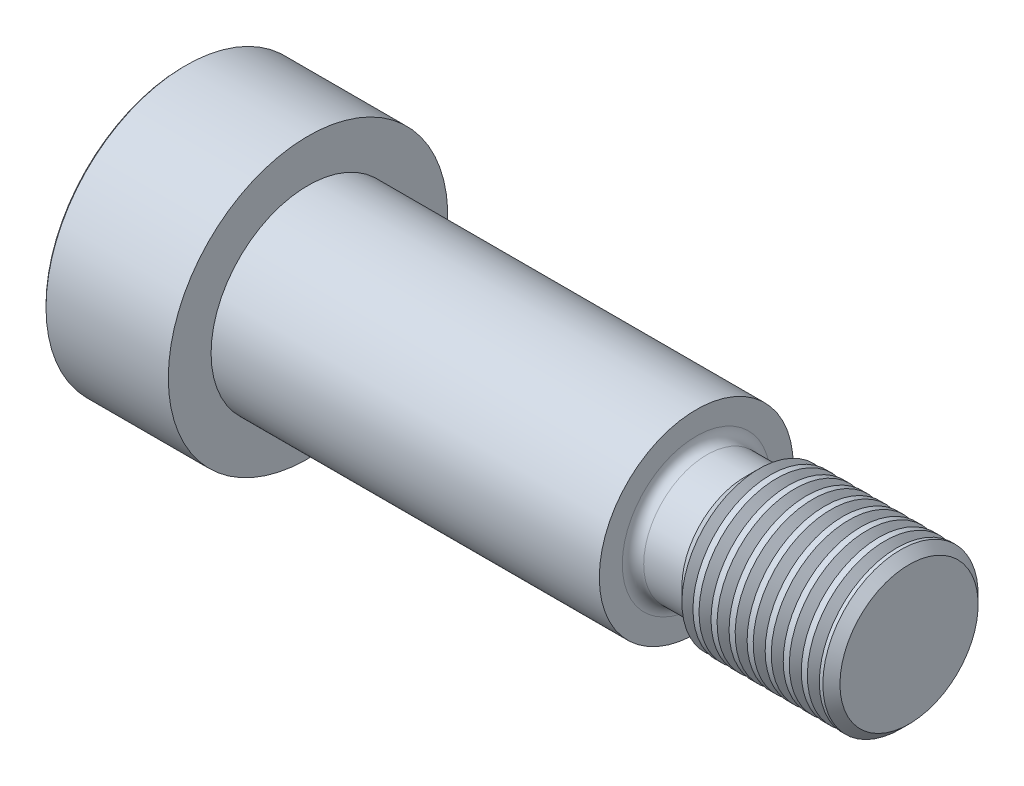
ISO-10303-21;
HEADER;
FILE_DESCRIPTION(('STEP AP214'),'2;1');
FILE_NAME('part.step','',(''),(''),'','','');
FILE_SCHEMA(('AUTOMOTIVE_DESIGN { 1 0 10303 214 1 1 1 1 }'));
ENDSEC;
DATA;
#1=APPLICATION_CONTEXT('core data for automotive mechanical design processes');
#2=APPLICATION_PROTOCOL_DEFINITION('international standard','automotive_design',2000,#1);
#3=PRODUCT_CONTEXT('',#1,'mechanical');
#4=PRODUCT('Part','Part','',(#3));
#5=PRODUCT_RELATED_PRODUCT_CATEGORY('part','',(#4));
#6=PRODUCT_DEFINITION_FORMATION('','',#4);
#7=PRODUCT_DEFINITION_CONTEXT('part definition',#1,'design');
#8=PRODUCT_DEFINITION('design','',#6,#7);
#9=PRODUCT_DEFINITION_SHAPE('','',#8);
#10=(LENGTH_UNIT() NAMED_UNIT(*) SI_UNIT(.MILLI.,.METRE.));
#11=(NAMED_UNIT(*) PLANE_ANGLE_UNIT() SI_UNIT($,.RADIAN.));
#12=(NAMED_UNIT(*) SI_UNIT($,.STERADIAN.) SOLID_ANGLE_UNIT());
#13=UNCERTAINTY_MEASURE_WITH_UNIT(LENGTH_MEASURE(1.E-05),#10,'distance_accuracy_value','');
#14=(GEOMETRIC_REPRESENTATION_CONTEXT(3) GLOBAL_UNCERTAINTY_ASSIGNED_CONTEXT((#13)) GLOBAL_UNIT_ASSIGNED_CONTEXT((#10,
#11,#12)) REPRESENTATION_CONTEXT('',''));
#15=CARTESIAN_POINT('',(0.,0.,0.));
#16=DIRECTION('',(0.,0.,1.));
#17=DIRECTION('',(1.,0.,0.));
#18=AXIS2_PLACEMENT_3D('',#15,#16,#17);
#19=CARTESIAN_POINT('',(0.,0.,0.));
#20=DIRECTION('',(-1.,0.,0.));
#21=DIRECTION('',(0.,0.,1.));
#22=AXIS2_PLACEMENT_3D('',#19,#20,#21);
#23=PLANE('',#22);
#24=CARTESIAN_POINT('',(0.,0.,0.));
#25=DIRECTION('',(-1.,0.,0.));
#26=DIRECTION('',(0.,0.,1.));
#27=AXIS2_PLACEMENT_3D('',#24,#25,#26);
#28=CIRCLE('',#27,17.75);
#29=CARTESIAN_POINT('',(0.,0.,17.75));
#30=VERTEX_POINT('',#29);
#31=EDGE_CURVE('E39',#30,#30,#28,.T.);
#32=ORIENTED_EDGE('',*,*,#31,.T.);
#33=EDGE_LOOP('',(#32));
#34=FACE_BOUND('',#33,.T.);
#35=DIRECTION('',(0.,-0.500000000000002,-0.866025403784438));
#36=VECTOR('',#35,1.);
#37=CARTESIAN_POINT('',(0.,-3.46410161513775,6.));
#38=LINE('',#37,#36);
#39=CARTESIAN_POINT('',(0.,-3.46410161513775,6.));
#40=VERTEX_POINT('',#39);
#41=CARTESIAN_POINT('',(0.,-6.92820323027552,0.));
#42=VERTEX_POINT('',#41);
#43=EDGE_CURVE('E47',#40,#42,#38,.T.);
#44=ORIENTED_EDGE('',*,*,#43,.T.);
#45=DIRECTION('',(0.,0.500000000000002,-0.866025403784438));
#46=VECTOR('',#45,1.);
#47=CARTESIAN_POINT('',(0.,-6.92820323027552,0.));
#48=LINE('',#47,#46);
#49=CARTESIAN_POINT('',(0.,-3.46410161513775,-6.));
#50=VERTEX_POINT('',#49);
#51=EDGE_CURVE('E179',#42,#50,#48,.T.);
#52=ORIENTED_EDGE('',*,*,#51,.T.);
#53=DIRECTION('',(0.,1.,0.));
#54=VECTOR('',#53,1.);
#55=CARTESIAN_POINT('',(0.,-3.46410161513775,-6.));
#56=LINE('',#55,#54);
#57=CARTESIAN_POINT('',(0.,3.46410161513776,-6.));
#58=VERTEX_POINT('',#57);
#59=EDGE_CURVE('E132',#50,#58,#56,.T.);
#60=ORIENTED_EDGE('',*,*,#59,.T.);
#61=DIRECTION('',(0.,0.5,0.866025403784439));
#62=VECTOR('',#61,1.);
#63=CARTESIAN_POINT('',(0.,3.46410161513776,-6.));
#64=LINE('',#63,#62);
#65=CARTESIAN_POINT('',(0.,6.92820323027551,0.));
#66=VERTEX_POINT('',#65);
#67=EDGE_CURVE('E262',#58,#66,#64,.T.);
#68=ORIENTED_EDGE('',*,*,#67,.T.);
#69=DIRECTION('',(0.,-0.5,0.866025403784439));
#70=VECTOR('',#69,1.);
#71=CARTESIAN_POINT('',(0.,6.92820323027551,0.));
#72=LINE('',#71,#70);
#73=CARTESIAN_POINT('',(0.,3.46410161513776,6.));
#74=VERTEX_POINT('',#73);
#75=EDGE_CURVE('E264',#66,#74,#72,.T.);
#76=ORIENTED_EDGE('',*,*,#75,.T.);
#77=DIRECTION('',(0.,-1.,0.));
#78=VECTOR('',#77,1.);
#79=CARTESIAN_POINT('',(0.,3.46410161513776,6.));
#80=LINE('',#79,#78);
#81=EDGE_CURVE('E266',#74,#40,#80,.T.);
#82=ORIENTED_EDGE('',*,*,#81,.T.);
#83=EDGE_LOOP('',(#44,#52,#60,#68,#76,#82));
#84=FACE_BOUND('',#83,.T.);
#85=ADVANCED_FACE('F30',(#34,#84),#23,.T.);
#86=CARTESIAN_POINT('',(72.3,0.,0.));
#87=DIRECTION('',(1.,0.,0.));
#88=DIRECTION('',(0.,0.,-1.));
#89=AXIS2_PLACEMENT_3D('',#86,#87,#88);
#90=CONICAL_SURFACE('',#89,8.15,0.785398163397447);
#91=CARTESIAN_POINT('',(74.0786683533554,0.,0.));
#92=DIRECTION('',(-1.,0.,0.));
#93=DIRECTION('',(0.,-1.,0.));
#94=AXIS2_PLACEMENT_3D('',#91,#92,#93);
#95=CIRCLE('',#94,9.92866835335544);
#96=CARTESIAN_POINT('',(74.0786683533554,-9.92866835335544,0.));
#97=VERTEX_POINT('',#96);
#98=EDGE_CURVE('E172',#97,#97,#95,.F.);
#99=ORIENTED_EDGE('',*,*,#98,.F.);
#100=EDGE_LOOP('',(#99));
#101=FACE_BOUND('',#100,.T.);
#102=CARTESIAN_POINT('',(72.3,0.,0.));
#103=DIRECTION('',(-1.,0.,0.));
#104=DIRECTION('',(0.,0.,1.));
#105=AXIS2_PLACEMENT_3D('',#102,#103,#104);
#106=CIRCLE('',#105,8.15);
#107=CARTESIAN_POINT('',(72.3,0.,8.15));
#108=VERTEX_POINT('',#107);
#109=EDGE_CURVE('E161',#108,#108,#106,.T.);
#110=ORIENTED_EDGE('',*,*,#109,.F.);
#111=EDGE_LOOP('',(#110));
#112=FACE_BOUND('',#111,.T.);
#113=ADVANCED_FACE('F319',(#101,#112),#90,.T.);
#114=CARTESIAN_POINT('',(-6.34999999999999,0.,0.));
#115=DIRECTION('',(-1.,0.,0.));
#116=DIRECTION('',(0.,0.,1.));
#117=AXIS2_PLACEMENT_3D('',#114,#115,#116);
#118=CYLINDRICAL_SURFACE('',#117,8.15);
#119=ORIENTED_EDGE('',*,*,#109,.T.);
#120=EDGE_LOOP('',(#119));
#121=FACE_BOUND('',#120,.T.);
#122=CARTESIAN_POINT('',(67.38,0.,0.));
#123=DIRECTION('',(-1.,0.,0.));
#124=DIRECTION('',(0.,0.,1.));
#125=AXIS2_PLACEMENT_3D('',#122,#123,#124);
#126=CIRCLE('',#125,8.15);
#127=CARTESIAN_POINT('',(67.38,0.,8.15));
#128=VERTEX_POINT('',#127);
#129=EDGE_CURVE('E158',#128,#128,#126,.T.);
#130=ORIENTED_EDGE('',*,*,#129,.F.);
#131=EDGE_LOOP('',(#130));
#132=FACE_BOUND('',#131,.T.);
#133=ADVANCED_FACE('F325',(#121,#132),#118,.T.);
#134=CARTESIAN_POINT('',(67.38,0.,0.));
#135=DIRECTION('',(-1.,0.,0.));
#136=DIRECTION('',(0.,0.,1.));
#137=AXIS2_PLACEMENT_3D('',#134,#135,#136);
#138=TOROIDAL_SURFACE('',#137,9.53,1.38);
#139=ORIENTED_EDGE('',*,*,#129,.T.);
#140=EDGE_LOOP('',(#139));
#141=FACE_BOUND('',#140,.T.);
#142=CARTESIAN_POINT('',(66.,0.,0.));
#143=DIRECTION('',(-1.,0.,0.));
#144=DIRECTION('',(0.,0.,1.));
#145=AXIS2_PLACEMENT_3D('',#142,#143,#144);
#146=CIRCLE('',#145,9.53);
#147=CARTESIAN_POINT('',(66.,0.,9.53));
#148=VERTEX_POINT('',#147);
#149=EDGE_CURVE('E155',#148,#148,#146,.T.);
#150=ORIENTED_EDGE('',*,*,#149,.F.);
#151=EDGE_LOOP('',(#150));
#152=FACE_BOUND('',#151,.T.);
#153=ADVANCED_FACE('F346',(#141,#152),#138,.F.);
#154=CARTESIAN_POINT('',(66.,12.49,0.));
#155=DIRECTION('',(1.,0.,0.));
#156=DIRECTION('',(0.,0.,-1.));
#157=AXIS2_PLACEMENT_3D('',#154,#155,#156);
#158=PLANE('',#157);
#159=ORIENTED_EDGE('',*,*,#149,.T.);
#160=EDGE_LOOP('',(#159));
#161=FACE_BOUND('',#160,.T.);
#162=CARTESIAN_POINT('',(66.,0.,0.));
#163=DIRECTION('',(-1.,0.,0.));
#164=DIRECTION('',(0.,0.,1.));
#165=AXIS2_PLACEMENT_3D('',#162,#163,#164);
#166=CIRCLE('',#165,12.49);
#167=CARTESIAN_POINT('',(66.,0.,12.49));
#168=VERTEX_POINT('',#167);
#169=EDGE_CURVE('E152',#168,#168,#166,.T.);
#170=ORIENTED_EDGE('',*,*,#169,.F.);
#171=EDGE_LOOP('',(#170));
#172=FACE_BOUND('',#171,.T.);
#173=ADVANCED_FACE('F342',(#161,#172),#158,.T.);
#174=CARTESIAN_POINT('',(-6.34999999999999,0.,0.));
#175=DIRECTION('',(-1.,0.,0.));
#176=DIRECTION('',(0.,0.,1.));
#177=AXIS2_PLACEMENT_3D('',#174,#175,#176);
#178=CYLINDRICAL_SURFACE('',#177,12.49);
#179=ORIENTED_EDGE('',*,*,#169,.T.);
#180=EDGE_LOOP('',(#179));
#181=FACE_BOUND('',#180,.T.);
#182=CARTESIAN_POINT('',(16.,0.,0.));
#183=DIRECTION('',(-1.,0.,0.));
#184=DIRECTION('',(0.,0.,1.));
#185=AXIS2_PLACEMENT_3D('',#182,#183,#184);
#186=CIRCLE('',#185,12.49);
#187=CARTESIAN_POINT('',(16.,0.,12.49));
#188=VERTEX_POINT('',#187);
#189=EDGE_CURVE('E149',#188,#188,#186,.T.);
#190=ORIENTED_EDGE('',*,*,#189,.F.);
#191=EDGE_LOOP('',(#190));
#192=FACE_BOUND('',#191,.T.);
#193=ADVANCED_FACE('F338',(#181,#192),#178,.T.);
#194=CARTESIAN_POINT('',(16.,18.,0.));
#195=DIRECTION('',(1.,0.,0.));
#196=DIRECTION('',(0.,0.,-1.));
#197=AXIS2_PLACEMENT_3D('',#194,#195,#196);
#198=PLANE('',#197);
#199=ORIENTED_EDGE('',*,*,#189,.T.);
#200=EDGE_LOOP('',(#199));
#201=FACE_BOUND('',#200,.T.);
#202=CARTESIAN_POINT('',(16.,0.,0.));
#203=DIRECTION('',(-1.,0.,0.));
#204=DIRECTION('',(0.,0.,1.));
#205=AXIS2_PLACEMENT_3D('',#202,#203,#204);
#206=CIRCLE('',#205,18.);
#207=CARTESIAN_POINT('',(16.,0.,18.));
#208=VERTEX_POINT('',#207);
#209=EDGE_CURVE('E145',#208,#208,#206,.T.);
#210=ORIENTED_EDGE('',*,*,#209,.F.);
#211=EDGE_LOOP('',(#210));
#212=FACE_BOUND('',#211,.T.);
#213=ADVANCED_FACE('F334',(#201,#212),#198,.T.);
#214=CARTESIAN_POINT('',(-6.34999999999999,0.,0.));
#215=DIRECTION('',(-1.,0.,0.));
#216=DIRECTION('',(0.,0.,1.));
#217=AXIS2_PLACEMENT_3D('',#214,#215,#216);
#218=CYLINDRICAL_SURFACE('',#217,18.);
#219=CARTESIAN_POINT('',(0.249999999999997,0.,0.));
#220=DIRECTION('',(-1.,0.,0.));
#221=DIRECTION('',(0.,0.,1.));
#222=AXIS2_PLACEMENT_3D('',#219,#220,#221);
#223=CIRCLE('',#222,18.);
#224=CARTESIAN_POINT('',(0.249999999999997,0.,18.));
#225=VERTEX_POINT('',#224);
#226=EDGE_CURVE('E11',#225,#225,#223,.F.);
#227=ORIENTED_EDGE('',*,*,#226,.T.);
#228=EDGE_LOOP('',(#227));
#229=FACE_BOUND('',#228,.T.);
#230=ORIENTED_EDGE('',*,*,#209,.T.);
#231=EDGE_LOOP('',(#230));
#232=FACE_BOUND('',#231,.T.);
#233=ADVANCED_FACE('F331',(#229,#232),#218,.T.);
#234=CARTESIAN_POINT('',(0.,0.,0.));
#235=DIRECTION('',(1.,0.,0.));
#236=DIRECTION('',(0.,0.,-1.));
#237=AXIS2_PLACEMENT_3D('',#234,#235,#236);
#238=CONICAL_SURFACE('',#237,17.75,0.785398163397448);
#239=ORIENTED_EDGE('',*,*,#226,.F.);
#240=EDGE_LOOP('',(#239));
#241=FACE_BOUND('',#240,.T.);
#242=ORIENTED_EDGE('',*,*,#31,.F.);
#243=EDGE_LOOP('',(#242));
#244=FACE_BOUND('',#243,.T.);
#245=ADVANCED_FACE('F32',(#241,#244),#238,.T.);
#246=CARTESIAN_POINT('',(10.,-6.92820323027552,0.));
#247=DIRECTION('',(0.,0.866025403784438,0.500000000000002));
#248=DIRECTION('',(0.,-0.500000000000002,0.866025403784438));
#249=AXIS2_PLACEMENT_3D('',#246,#247,#248);
#250=PLANE('',#249);
#251=DIRECTION('',(0.,0.500000000000002,-0.866025403784438));
#252=VECTOR('',#251,1.);
#253=CARTESIAN_POINT('',(10.,-6.92820323027552,0.));
#254=LINE('',#253,#252);
#255=CARTESIAN_POINT('',(10.,-6.92820323027552,0.));
#256=VERTEX_POINT('',#255);
#257=CARTESIAN_POINT('',(10.,-5.19615242270663,-3.00000000000001));
#258=VERTEX_POINT('',#257);
#259=EDGE_CURVE('E115',#256,#258,#254,.T.);
#260=ORIENTED_EDGE('',*,*,#259,.T.);
#261=CARTESIAN_POINT('',(10.,-3.46410161513775,-6.));
#262=VERTEX_POINT('',#261);
#263=EDGE_CURVE('E108',#258,#262,#254,.T.);
#264=ORIENTED_EDGE('',*,*,#263,.T.);
#265=DIRECTION('',(-1.,0.,0.));
#266=VECTOR('',#265,1.);
#267=CARTESIAN_POINT('',(10.,-3.46410161513775,-6.));
#268=LINE('',#267,#266);
#269=EDGE_CURVE('E112',#262,#50,#268,.T.);
#270=ORIENTED_EDGE('',*,*,#269,.T.);
#271=ORIENTED_EDGE('',*,*,#51,.F.);
#272=DIRECTION('',(-1.,0.,0.));
#273=VECTOR('',#272,1.);
#274=CARTESIAN_POINT('',(10.,-6.92820323027552,0.));
#275=LINE('',#274,#273);
#276=EDGE_CURVE('E259',#256,#42,#275,.T.);
#277=ORIENTED_EDGE('',*,*,#276,.F.);
#278=EDGE_LOOP('',(#260,#264,#270,#271,#277));
#279=FACE_BOUND('',#278,.T.);
#280=ADVANCED_FACE('F110',(#279),#250,.T.);
#281=CARTESIAN_POINT('',(10.,-3.46410161513775,-6.));
#282=DIRECTION('',(0.,0.,1.));
#283=DIRECTION('',(1.,0.,0.));
#284=AXIS2_PLACEMENT_3D('',#281,#282,#283);
#285=PLANE('',#284);
#286=DIRECTION('',(0.,1.,0.));
#287=VECTOR('',#286,1.);
#288=CARTESIAN_POINT('',(10.,-3.46410161513775,-6.));
#289=LINE('',#288,#287);
#290=CARTESIAN_POINT('',(10.,0.,-6.));
#291=VERTEX_POINT('',#290);
#292=EDGE_CURVE('E120',#262,#291,#289,.T.);
#293=ORIENTED_EDGE('',*,*,#292,.T.);
#294=CARTESIAN_POINT('',(10.,3.46410161513776,-6.));
#295=VERTEX_POINT('',#294);
#296=EDGE_CURVE('E127',#291,#295,#289,.T.);
#297=ORIENTED_EDGE('',*,*,#296,.T.);
#298=DIRECTION('',(-1.,0.,0.));
#299=VECTOR('',#298,1.);
#300=CARTESIAN_POINT('',(10.,3.46410161513776,-6.));
#301=LINE('',#300,#299);
#302=EDGE_CURVE('E134',#295,#58,#301,.T.);
#303=ORIENTED_EDGE('',*,*,#302,.T.);
#304=ORIENTED_EDGE('',*,*,#59,.F.);
#305=ORIENTED_EDGE('',*,*,#269,.F.);
#306=EDGE_LOOP('',(#293,#297,#303,#304,#305));
#307=FACE_BOUND('',#306,.T.);
#308=ADVANCED_FACE('F130',(#307),#285,.T.);
#309=CARTESIAN_POINT('',(10.,3.46410161513776,-6.));
#310=DIRECTION('',(0.,-0.866025403784438,0.5));
#311=DIRECTION('',(0.,-0.5,-0.866025403784438));
#312=AXIS2_PLACEMENT_3D('',#309,#310,#311);
#313=PLANE('',#312);
#314=DIRECTION('',(0.,0.5,0.866025403784439));
#315=VECTOR('',#314,1.);
#316=CARTESIAN_POINT('',(10.,3.46410161513776,-6.));
#317=LINE('',#316,#315);
#318=CARTESIAN_POINT('',(10.,5.19615242270663,-3.));
#319=VERTEX_POINT('',#318);
#320=EDGE_CURVE('E246',#295,#319,#317,.T.);
#321=ORIENTED_EDGE('',*,*,#320,.T.);
#322=CARTESIAN_POINT('',(10.,6.92820323027551,0.));
#323=VERTEX_POINT('',#322);
#324=EDGE_CURVE('E126',#319,#323,#317,.T.);
#325=ORIENTED_EDGE('',*,*,#324,.T.);
#326=DIRECTION('',(-1.,0.,0.));
#327=VECTOR('',#326,1.);
#328=CARTESIAN_POINT('',(10.,6.92820323027551,0.));
#329=LINE('',#328,#327);
#330=EDGE_CURVE('E140',#323,#66,#329,.T.);
#331=ORIENTED_EDGE('',*,*,#330,.T.);
#332=ORIENTED_EDGE('',*,*,#67,.F.);
#333=ORIENTED_EDGE('',*,*,#302,.F.);
#334=EDGE_LOOP('',(#321,#325,#331,#332,#333));
#335=FACE_BOUND('',#334,.T.);
#336=ADVANCED_FACE('F281',(#335),#313,.T.);
#337=CARTESIAN_POINT('',(10.,6.92820323027551,0.));
#338=DIRECTION('',(0.,-0.866025403784438,-0.5));
#339=DIRECTION('',(0.,0.5,-0.866025403784438));
#340=AXIS2_PLACEMENT_3D('',#337,#338,#339);
#341=PLANE('',#340);
#342=DIRECTION('',(0.,-0.5,0.866025403784439));
#343=VECTOR('',#342,1.);
#344=CARTESIAN_POINT('',(10.,6.92820323027551,0.));
#345=LINE('',#344,#343);
#346=CARTESIAN_POINT('',(10.,5.19615242270663,3.));
#347=VERTEX_POINT('',#346);
#348=EDGE_CURVE('E250',#323,#347,#345,.T.);
#349=ORIENTED_EDGE('',*,*,#348,.T.);
#350=CARTESIAN_POINT('',(10.,3.46410161513776,6.));
#351=VERTEX_POINT('',#350);
#352=EDGE_CURVE('E249',#347,#351,#345,.T.);
#353=ORIENTED_EDGE('',*,*,#352,.T.);
#354=DIRECTION('',(-1.,0.,0.));
#355=VECTOR('',#354,1.);
#356=CARTESIAN_POINT('',(10.,3.46410161513776,6.));
#357=LINE('',#356,#355);
#358=EDGE_CURVE('E274',#351,#74,#357,.T.);
#359=ORIENTED_EDGE('',*,*,#358,.T.);
#360=ORIENTED_EDGE('',*,*,#75,.F.);
#361=ORIENTED_EDGE('',*,*,#330,.F.);
#362=EDGE_LOOP('',(#349,#353,#359,#360,#361));
#363=FACE_BOUND('',#362,.T.);
#364=ADVANCED_FACE('F286',(#363),#341,.T.);
#365=CARTESIAN_POINT('',(10.,3.46410161513776,6.));
#366=DIRECTION('',(0.,0.,-1.));
#367=DIRECTION('',(-1.,0.,0.));
#368=AXIS2_PLACEMENT_3D('',#365,#366,#367);
#369=PLANE('',#368);
#370=DIRECTION('',(0.,-1.,0.));
#371=VECTOR('',#370,1.);
#372=CARTESIAN_POINT('',(10.,3.46410161513776,6.));
#373=LINE('',#372,#371);
#374=CARTESIAN_POINT('',(10.,0.,6.));
#375=VERTEX_POINT('',#374);
#376=EDGE_CURVE('E55',#351,#375,#373,.T.);
#377=ORIENTED_EDGE('',*,*,#376,.T.);
#378=CARTESIAN_POINT('',(10.,-3.46410161513775,6.));
#379=VERTEX_POINT('',#378);
#380=EDGE_CURVE('E253',#375,#379,#373,.T.);
#381=ORIENTED_EDGE('',*,*,#380,.T.);
#382=DIRECTION('',(-1.,0.,0.));
#383=VECTOR('',#382,1.);
#384=CARTESIAN_POINT('',(10.,-3.46410161513775,6.));
#385=LINE('',#384,#383);
#386=EDGE_CURVE('E271',#379,#40,#385,.T.);
#387=ORIENTED_EDGE('',*,*,#386,.T.);
#388=ORIENTED_EDGE('',*,*,#81,.F.);
#389=ORIENTED_EDGE('',*,*,#358,.F.);
#390=EDGE_LOOP('',(#377,#381,#387,#388,#389));
#391=FACE_BOUND('',#390,.T.);
#392=ADVANCED_FACE('F311',(#391),#369,.T.);
#393=CARTESIAN_POINT('',(10.,-3.46410161513775,6.));
#394=DIRECTION('',(0.,0.866025403784438,-0.500000000000002));
#395=DIRECTION('',(0.,0.500000000000002,0.866025403784438));
#396=AXIS2_PLACEMENT_3D('',#393,#394,#395);
#397=PLANE('',#396);
#398=DIRECTION('',(0.,-0.500000000000002,-0.866025403784438));
#399=VECTOR('',#398,1.);
#400=CARTESIAN_POINT('',(10.,-3.46410161513775,6.));
#401=LINE('',#400,#399);
#402=CARTESIAN_POINT('',(10.,-5.19615242270663,3.00000000000001));
#403=VERTEX_POINT('',#402);
#404=EDGE_CURVE('E256',#379,#403,#401,.T.);
#405=ORIENTED_EDGE('',*,*,#404,.T.);
#406=EDGE_CURVE('E255',#403,#256,#401,.T.);
#407=ORIENTED_EDGE('',*,*,#406,.T.);
#408=ORIENTED_EDGE('',*,*,#276,.T.);
#409=ORIENTED_EDGE('',*,*,#43,.F.);
#410=ORIENTED_EDGE('',*,*,#386,.F.);
#411=EDGE_LOOP('',(#405,#407,#408,#409,#410));
#412=FACE_BOUND('',#411,.T.);
#413=ADVANCED_FACE('F304',(#412),#397,.T.);
#414=CARTESIAN_POINT('',(10.,-6.92820323027552,0.));
#415=DIRECTION('',(-1.,0.,0.));
#416=DIRECTION('',(0.,0.,1.));
#417=AXIS2_PLACEMENT_3D('',#414,#415,#416);
#418=PLANE('',#417);
#419=ORIENTED_EDGE('',*,*,#376,.F.);
#420=ORIENTED_EDGE('',*,*,#352,.F.);
#421=CARTESIAN_POINT('',(10.,0.,0.));
#422=DIRECTION('',(-1.,0.,0.));
#423=DIRECTION('',(0.,0.,1.));
#424=AXIS2_PLACEMENT_3D('',#421,#422,#423);
#425=CIRCLE('',#424,6.);
#426=EDGE_CURVE('E139',#375,#347,#425,.T.);
#427=ORIENTED_EDGE('',*,*,#426,.F.);
#428=EDGE_LOOP('',(#419,#420,#427));
#429=FACE_BOUND('',#428,.T.);
#430=ADVANCED_FACE('F302',(#429),#418,.T.);
#431=ORIENTED_EDGE('',*,*,#348,.F.);
#432=ORIENTED_EDGE('',*,*,#324,.F.);
#433=EDGE_CURVE('E146',#347,#319,#425,.T.);
#434=ORIENTED_EDGE('',*,*,#433,.F.);
#435=EDGE_LOOP('',(#431,#432,#434));
#436=FACE_BOUND('',#435,.T.);
#437=ADVANCED_FACE('F295',(#436),#418,.T.);
#438=ORIENTED_EDGE('',*,*,#320,.F.);
#439=ORIENTED_EDGE('',*,*,#296,.F.);
#440=EDGE_CURVE('E292',#319,#291,#425,.T.);
#441=ORIENTED_EDGE('',*,*,#440,.F.);
#442=EDGE_LOOP('',(#438,#439,#441));
#443=FACE_BOUND('',#442,.T.);
#444=ADVANCED_FACE('F291',(#443),#418,.T.);
#445=ORIENTED_EDGE('',*,*,#292,.F.);
#446=ORIENTED_EDGE('',*,*,#263,.F.);
#447=EDGE_CURVE('E122',#291,#258,#425,.T.);
#448=ORIENTED_EDGE('',*,*,#447,.F.);
#449=EDGE_LOOP('',(#445,#446,#448));
#450=FACE_BOUND('',#449,.T.);
#451=ADVANCED_FACE('F121',(#450),#418,.T.);
#452=ORIENTED_EDGE('',*,*,#259,.F.);
#453=ORIENTED_EDGE('',*,*,#406,.F.);
#454=EDGE_CURVE('E137',#258,#403,#425,.T.);
#455=ORIENTED_EDGE('',*,*,#454,.F.);
#456=EDGE_LOOP('',(#452,#453,#455));
#457=FACE_BOUND('',#456,.T.);
#458=ADVANCED_FACE('F316',(#457),#418,.T.);
#459=ORIENTED_EDGE('',*,*,#404,.F.);
#460=ORIENTED_EDGE('',*,*,#380,.F.);
#461=EDGE_CURVE('E133',#403,#375,#425,.T.);
#462=ORIENTED_EDGE('',*,*,#461,.F.);
#463=EDGE_LOOP('',(#459,#460,#462));
#464=FACE_BOUND('',#463,.T.);
#465=ADVANCED_FACE('F306',(#464),#418,.T.);
#466=CARTESIAN_POINT('',(13.4641016151378,0.,0.));
#467=DIRECTION('',(-1.,0.,0.));
#468=DIRECTION('',(0.,0.,1.));
#469=AXIS2_PLACEMENT_3D('',#466,#467,#468);
#470=CONICAL_SURFACE('',#469,0.,1.04719755119659);
#471=ORIENTED_EDGE('',*,*,#426,.T.);
#472=ORIENTED_EDGE('',*,*,#433,.T.);
#473=ORIENTED_EDGE('',*,*,#440,.T.);
#474=ORIENTED_EDGE('',*,*,#447,.T.);
#475=ORIENTED_EDGE('',*,*,#454,.T.);
#476=ORIENTED_EDGE('',*,*,#461,.T.);
#477=EDGE_LOOP('',(#471,#472,#473,#474,#475,#476));
#478=FACE_BOUND('',#477,.T.);
#479=CARTESIAN_POINT('',(13.4641016151378,0.,0.));
#480=VERTEX_POINT('',#479);
#481=VERTEX_LOOP('',#480);
#482=FACE_BOUND('',#481,.T.);
#483=ADVANCED_FACE('F298',(#478,#482),#470,.F.);
#484=CARTESIAN_POINT('',(77.3147953734802,0.,0.));
#485=DIRECTION('',(1.,0.,0.));
#486=DIRECTION('',(0.,1.,0.));
#487=AXIS2_PLACEMENT_3D('',#484,#485,#486);
#488=CONICAL_SURFACE('',#487,12.49,0.959931088596885);
#489=CARTESIAN_POINT('',(75.571278603338,0.,0.));
#490=DIRECTION('',(1.,0.,0.));
#491=DIRECTION('',(0.,1.,0.));
#492=AXIS2_PLACEMENT_3D('',#489,#490,#491);
#493=CIRCLE('',#492,10.);
#494=CARTESIAN_POINT('',(75.571278603338,10.,0.));
#495=VERTEX_POINT('',#494);
#496=EDGE_CURVE('E175',#495,#495,#493,.F.);
#497=ORIENTED_EDGE('',*,*,#496,.T.);
#498=EDGE_LOOP('',(#497));
#499=FACE_BOUND('',#498,.T.);
#500=CARTESIAN_POINT('',(74.8,0.,0.));
#501=DIRECTION('',(-1.,0.,0.));
#502=DIRECTION('',(0.,-1.,0.));
#503=AXIS2_PLACEMENT_3D('',#500,#501,#502);
#504=CIRCLE('',#503,8.89850000000001);
#505=CARTESIAN_POINT('',(74.8,-8.8985,0.));
#506=VERTEX_POINT('',#505);
#507=EDGE_CURVE('E176',#506,#506,#504,.T.);
#508=ORIENTED_EDGE('',*,*,#507,.F.);
#509=EDGE_LOOP('',(#508));
#510=FACE_BOUND('',#509,.T.);
#511=ADVANCED_FACE('F481',(#499,#510),#488,.T.);
#512=CARTESIAN_POINT('',(74.8,0.,0.));
#513=DIRECTION('',(-1.,0.,0.));
#514=DIRECTION('',(0.,-1.,0.));
#515=AXIS2_PLACEMENT_3D('',#512,#513,#514);
#516=CONICAL_SURFACE('',#515,8.89850000000001,0.959931088596877);
#517=ORIENTED_EDGE('',*,*,#98,.T.);
#518=EDGE_LOOP('',(#517));
#519=FACE_BOUND('',#518,.T.);
#520=ORIENTED_EDGE('',*,*,#507,.T.);
#521=EDGE_LOOP('',(#520));
#522=FACE_BOUND('',#521,.T.);
#523=ADVANCED_FACE('F358',(#519,#522),#516,.T.);
#524=CARTESIAN_POINT('',(-6.34999999999999,0.,0.));
#525=DIRECTION('',(-1.,0.,0.));
#526=DIRECTION('',(0.,0.,1.));
#527=AXIS2_PLACEMENT_3D('',#524,#525,#526);
#528=CYLINDRICAL_SURFACE('',#527,10.);
#529=CARTESIAN_POINT('',(76.353721396662,0.,0.));
#530=DIRECTION('',(-1.,0.,0.));
#531=DIRECTION('',(0.,-1.,0.));
#532=AXIS2_PLACEMENT_3D('',#529,#530,#531);
#533=CIRCLE('',#532,10.);
#534=CARTESIAN_POINT('',(76.353721396662,-9.99999999999999,0.));
#535=VERTEX_POINT('',#534);
#536=EDGE_CURVE('E180',#535,#535,#533,.F.);
#537=ORIENTED_EDGE('',*,*,#536,.F.);
#538=EDGE_LOOP('',(#537));
#539=FACE_BOUND('',#538,.T.);
#540=ORIENTED_EDGE('',*,*,#496,.F.);
#541=EDGE_LOOP('',(#540));
#542=FACE_BOUND('',#541,.T.);
#543=ADVANCED_FACE('F354',(#539,#542),#528,.T.);
#544=CARTESIAN_POINT('',(79.6397953734802,0.,0.));
#545=DIRECTION('',(1.,0.,0.));
#546=DIRECTION('',(0.,1.,0.));
#547=AXIS2_PLACEMENT_3D('',#544,#545,#546);
#548=CONICAL_SURFACE('',#547,12.49,0.959931088596885);
#549=CARTESIAN_POINT('',(77.896278603338,0.,0.));
#550=DIRECTION('',(1.,0.,0.));
#551=DIRECTION('',(0.,1.,0.));
#552=AXIS2_PLACEMENT_3D('',#549,#550,#551);
#553=CIRCLE('',#552,10.);
#554=CARTESIAN_POINT('',(77.896278603338,10.,0.));
#555=VERTEX_POINT('',#554);
#556=EDGE_CURVE('E183',#555,#555,#553,.F.);
#557=ORIENTED_EDGE('',*,*,#556,.T.);
#558=EDGE_LOOP('',(#557));
#559=FACE_BOUND('',#558,.T.);
#560=CARTESIAN_POINT('',(77.125,0.,0.));
#561=DIRECTION('',(-1.,0.,0.));
#562=DIRECTION('',(0.,-1.,0.));
#563=AXIS2_PLACEMENT_3D('',#560,#561,#562);
#564=CIRCLE('',#563,8.89850000000001);
#565=CARTESIAN_POINT('',(77.125,-8.8985,0.));
#566=VERTEX_POINT('',#565);
#567=EDGE_CURVE('E184',#566,#566,#564,.T.);
#568=ORIENTED_EDGE('',*,*,#567,.F.);
#569=EDGE_LOOP('',(#568));
#570=FACE_BOUND('',#569,.T.);
#571=ADVANCED_FACE('F357',(#559,#570),#548,.T.);
#572=CARTESIAN_POINT('',(77.125,0.,0.));
#573=DIRECTION('',(-1.,0.,0.));
#574=DIRECTION('',(0.,-1.,0.));
#575=AXIS2_PLACEMENT_3D('',#572,#573,#574);
#576=CONICAL_SURFACE('',#575,8.89850000000001,0.959931088596877);
#577=ORIENTED_EDGE('',*,*,#536,.T.);
#578=EDGE_LOOP('',(#577));
#579=FACE_BOUND('',#578,.T.);
#580=ORIENTED_EDGE('',*,*,#567,.T.);
#581=EDGE_LOOP('',(#580));
#582=FACE_BOUND('',#581,.T.);
#583=ADVANCED_FACE('F458',(#579,#582),#576,.T.);
#584=CARTESIAN_POINT('',(78.678721396662,0.,0.));
#585=DIRECTION('',(-1.,0.,0.));
#586=DIRECTION('',(0.,-1.,0.));
#587=AXIS2_PLACEMENT_3D('',#584,#585,#586);
#588=CIRCLE('',#587,10.);
#589=CARTESIAN_POINT('',(78.678721396662,-9.99999999999999,0.));
#590=VERTEX_POINT('',#589);
#591=EDGE_CURVE('E187',#590,#590,#588,.F.);
#592=ORIENTED_EDGE('',*,*,#591,.F.);
#593=EDGE_LOOP('',(#592));
#594=FACE_BOUND('',#593,.T.);
#595=ORIENTED_EDGE('',*,*,#556,.F.);
#596=EDGE_LOOP('',(#595));
#597=FACE_BOUND('',#596,.T.);
#598=ADVANCED_FACE('F361',(#594,#597),#528,.T.);
#599=CARTESIAN_POINT('',(81.9647953734802,0.,0.));
#600=DIRECTION('',(1.,0.,0.));
#601=DIRECTION('',(0.,1.,0.));
#602=AXIS2_PLACEMENT_3D('',#599,#600,#601);
#603=CONICAL_SURFACE('',#602,12.49,0.959931088596885);
#604=CARTESIAN_POINT('',(80.221278603338,0.,0.));
#605=DIRECTION('',(1.,0.,0.));
#606=DIRECTION('',(0.,1.,0.));
#607=AXIS2_PLACEMENT_3D('',#604,#605,#606);
#608=CIRCLE('',#607,10.);
#609=CARTESIAN_POINT('',(80.221278603338,10.,0.));
#610=VERTEX_POINT('',#609);
#611=EDGE_CURVE('E190',#610,#610,#608,.F.);
#612=ORIENTED_EDGE('',*,*,#611,.T.);
#613=EDGE_LOOP('',(#612));
#614=FACE_BOUND('',#613,.T.);
#615=CARTESIAN_POINT('',(79.45,0.,0.));
#616=DIRECTION('',(-1.,0.,0.));
#617=DIRECTION('',(0.,-1.,0.));
#618=AXIS2_PLACEMENT_3D('',#615,#616,#617);
#619=CIRCLE('',#618,8.89850000000001);
#620=CARTESIAN_POINT('',(79.45,-8.8985,0.));
#621=VERTEX_POINT('',#620);
#622=EDGE_CURVE('E191',#621,#621,#619,.T.);
#623=ORIENTED_EDGE('',*,*,#622,.F.);
#624=EDGE_LOOP('',(#623));
#625=FACE_BOUND('',#624,.T.);
#626=ADVANCED_FACE('F452',(#614,#625),#603,.T.);
#627=CARTESIAN_POINT('',(79.45,0.,0.));
#628=DIRECTION('',(-1.,0.,0.));
#629=DIRECTION('',(0.,-1.,0.));
#630=AXIS2_PLACEMENT_3D('',#627,#628,#629);
#631=CONICAL_SURFACE('',#630,8.89850000000001,0.959931088596877);
#632=ORIENTED_EDGE('',*,*,#591,.T.);
#633=EDGE_LOOP('',(#632));
#634=FACE_BOUND('',#633,.T.);
#635=ORIENTED_EDGE('',*,*,#622,.T.);
#636=EDGE_LOOP('',(#635));
#637=FACE_BOUND('',#636,.T.);
#638=ADVANCED_FACE('F444',(#634,#637),#631,.T.);
#639=CARTESIAN_POINT('',(81.003721396662,0.,0.));
#640=DIRECTION('',(-1.,0.,0.));
#641=DIRECTION('',(0.,-1.,0.));
#642=AXIS2_PLACEMENT_3D('',#639,#640,#641);
#643=CIRCLE('',#642,10.);
#644=CARTESIAN_POINT('',(81.003721396662,-9.99999999999999,0.));
#645=VERTEX_POINT('',#644);
#646=EDGE_CURVE('E194',#645,#645,#643,.F.);
#647=ORIENTED_EDGE('',*,*,#646,.F.);
#648=EDGE_LOOP('',(#647));
#649=FACE_BOUND('',#648,.T.);
#650=ORIENTED_EDGE('',*,*,#611,.F.);
#651=EDGE_LOOP('',(#650));
#652=FACE_BOUND('',#651,.T.);
#653=ADVANCED_FACE('F431',(#649,#652),#528,.T.);
#654=CARTESIAN_POINT('',(84.2897953734801,0.,0.));
#655=DIRECTION('',(1.,0.,0.));
#656=DIRECTION('',(0.,1.,0.));
#657=AXIS2_PLACEMENT_3D('',#654,#655,#656);
#658=CONICAL_SURFACE('',#657,12.49,0.959931088596885);
#659=CARTESIAN_POINT('',(82.546278603338,0.,0.));
#660=DIRECTION('',(1.,0.,0.));
#661=DIRECTION('',(0.,1.,0.));
#662=AXIS2_PLACEMENT_3D('',#659,#660,#661);
#663=CIRCLE('',#662,10.);
#664=CARTESIAN_POINT('',(82.546278603338,10.,0.));
#665=VERTEX_POINT('',#664);
#666=EDGE_CURVE('E197',#665,#665,#663,.F.);
#667=ORIENTED_EDGE('',*,*,#666,.T.);
#668=EDGE_LOOP('',(#667));
#669=FACE_BOUND('',#668,.T.);
#670=CARTESIAN_POINT('',(81.775,0.,0.));
#671=DIRECTION('',(-1.,0.,0.));
#672=DIRECTION('',(0.,-1.,0.));
#673=AXIS2_PLACEMENT_3D('',#670,#671,#672);
#674=CIRCLE('',#673,8.89850000000001);
#675=CARTESIAN_POINT('',(81.775,-8.8985,0.));
#676=VERTEX_POINT('',#675);
#677=EDGE_CURVE('E198',#676,#676,#674,.T.);
#678=ORIENTED_EDGE('',*,*,#677,.F.);
#679=EDGE_LOOP('',(#678));
#680=FACE_BOUND('',#679,.T.);
#681=ADVANCED_FACE('F438',(#669,#680),#658,.T.);
#682=CARTESIAN_POINT('',(81.775,0.,0.));
#683=DIRECTION('',(-1.,0.,0.));
#684=DIRECTION('',(0.,-1.,0.));
#685=AXIS2_PLACEMENT_3D('',#682,#683,#684);
#686=CONICAL_SURFACE('',#685,8.89850000000001,0.959931088596877);
#687=ORIENTED_EDGE('',*,*,#646,.T.);
#688=EDGE_LOOP('',(#687));
#689=FACE_BOUND('',#688,.T.);
#690=ORIENTED_EDGE('',*,*,#677,.T.);
#691=EDGE_LOOP('',(#690));
#692=FACE_BOUND('',#691,.T.);
#693=ADVANCED_FACE('F429',(#689,#692),#686,.T.);
#694=CARTESIAN_POINT('',(83.328721396662,0.,0.));
#695=DIRECTION('',(-1.,0.,0.));
#696=DIRECTION('',(0.,-1.,0.));
#697=AXIS2_PLACEMENT_3D('',#694,#695,#696);
#698=CIRCLE('',#697,10.);
#699=CARTESIAN_POINT('',(83.328721396662,-9.99999999999999,0.));
#700=VERTEX_POINT('',#699);
#701=EDGE_CURVE('E201',#700,#700,#698,.F.);
#702=ORIENTED_EDGE('',*,*,#701,.F.);
#703=EDGE_LOOP('',(#702));
#704=FACE_BOUND('',#703,.T.);
#705=ORIENTED_EDGE('',*,*,#666,.F.);
#706=EDGE_LOOP('',(#705));
#707=FACE_BOUND('',#706,.T.);
#708=ADVANCED_FACE('F416',(#704,#707),#528,.T.);
#709=CARTESIAN_POINT('',(86.6147953734802,0.,0.));
#710=DIRECTION('',(1.,0.,0.));
#711=DIRECTION('',(0.,1.,0.));
#712=AXIS2_PLACEMENT_3D('',#709,#710,#711);
#713=CONICAL_SURFACE('',#712,12.49,0.959931088596885);
#714=CARTESIAN_POINT('',(84.871278603338,0.,0.));
#715=DIRECTION('',(1.,0.,0.));
#716=DIRECTION('',(0.,1.,0.));
#717=AXIS2_PLACEMENT_3D('',#714,#715,#716);
#718=CIRCLE('',#717,10.);
#719=CARTESIAN_POINT('',(84.871278603338,10.,0.));
#720=VERTEX_POINT('',#719);
#721=EDGE_CURVE('E204',#720,#720,#718,.F.);
#722=ORIENTED_EDGE('',*,*,#721,.T.);
#723=EDGE_LOOP('',(#722));
#724=FACE_BOUND('',#723,.T.);
#725=CARTESIAN_POINT('',(84.1,0.,0.));
#726=DIRECTION('',(-1.,0.,0.));
#727=DIRECTION('',(0.,-1.,0.));
#728=AXIS2_PLACEMENT_3D('',#725,#726,#727);
#729=CIRCLE('',#728,8.89850000000001);
#730=CARTESIAN_POINT('',(84.1,-8.8985,0.));
#731=VERTEX_POINT('',#730);
#732=EDGE_CURVE('E205',#731,#731,#729,.T.);
#733=ORIENTED_EDGE('',*,*,#732,.F.);
#734=EDGE_LOOP('',(#733));
#735=FACE_BOUND('',#734,.T.);
#736=ADVANCED_FACE('F423',(#724,#735),#713,.T.);
#737=CARTESIAN_POINT('',(84.1,0.,0.));
#738=DIRECTION('',(-1.,0.,0.));
#739=DIRECTION('',(0.,-1.,0.));
#740=AXIS2_PLACEMENT_3D('',#737,#738,#739);
#741=CONICAL_SURFACE('',#740,8.89850000000001,0.959931088596877);
#742=ORIENTED_EDGE('',*,*,#701,.T.);
#743=EDGE_LOOP('',(#742));
#744=FACE_BOUND('',#743,.T.);
#745=ORIENTED_EDGE('',*,*,#732,.T.);
#746=EDGE_LOOP('',(#745));
#747=FACE_BOUND('',#746,.T.);
#748=ADVANCED_FACE('F414',(#744,#747),#741,.T.);
#749=CARTESIAN_POINT('',(85.653721396662,0.,0.));
#750=DIRECTION('',(-1.,0.,0.));
#751=DIRECTION('',(0.,-1.,0.));
#752=AXIS2_PLACEMENT_3D('',#749,#750,#751);
#753=CIRCLE('',#752,10.);
#754=CARTESIAN_POINT('',(85.653721396662,-9.99999999999999,0.));
#755=VERTEX_POINT('',#754);
#756=EDGE_CURVE('E208',#755,#755,#753,.F.);
#757=ORIENTED_EDGE('',*,*,#756,.F.);
#758=EDGE_LOOP('',(#757));
#759=FACE_BOUND('',#758,.T.);
#760=ORIENTED_EDGE('',*,*,#721,.F.);
#761=EDGE_LOOP('',(#760));
#762=FACE_BOUND('',#761,.T.);
#763=ADVANCED_FACE('F401',(#759,#762),#528,.T.);
#764=CARTESIAN_POINT('',(88.9397953734802,0.,0.));
#765=DIRECTION('',(1.,0.,0.));
#766=DIRECTION('',(0.,1.,0.));
#767=AXIS2_PLACEMENT_3D('',#764,#765,#766);
#768=CONICAL_SURFACE('',#767,12.49,0.959931088596885);
#769=CARTESIAN_POINT('',(87.196278603338,0.,0.));
#770=DIRECTION('',(1.,0.,0.));
#771=DIRECTION('',(0.,1.,0.));
#772=AXIS2_PLACEMENT_3D('',#769,#770,#771);
#773=CIRCLE('',#772,10.);
#774=CARTESIAN_POINT('',(87.196278603338,10.,0.));
#775=VERTEX_POINT('',#774);
#776=EDGE_CURVE('E211',#775,#775,#773,.F.);
#777=ORIENTED_EDGE('',*,*,#776,.T.);
#778=EDGE_LOOP('',(#777));
#779=FACE_BOUND('',#778,.T.);
#780=CARTESIAN_POINT('',(86.425,0.,0.));
#781=DIRECTION('',(-1.,0.,0.));
#782=DIRECTION('',(0.,-1.,0.));
#783=AXIS2_PLACEMENT_3D('',#780,#781,#782);
#784=CIRCLE('',#783,8.89850000000001);
#785=CARTESIAN_POINT('',(86.425,-8.8985,0.));
#786=VERTEX_POINT('',#785);
#787=EDGE_CURVE('E212',#786,#786,#784,.T.);
#788=ORIENTED_EDGE('',*,*,#787,.F.);
#789=EDGE_LOOP('',(#788));
#790=FACE_BOUND('',#789,.T.);
#791=ADVANCED_FACE('F408',(#779,#790),#768,.T.);
#792=CARTESIAN_POINT('',(86.425,0.,0.));
#793=DIRECTION('',(-1.,0.,0.));
#794=DIRECTION('',(0.,-1.,0.));
#795=AXIS2_PLACEMENT_3D('',#792,#793,#794);
#796=CONICAL_SURFACE('',#795,8.89850000000001,0.959931088596877);
#797=ORIENTED_EDGE('',*,*,#756,.T.);
#798=EDGE_LOOP('',(#797));
#799=FACE_BOUND('',#798,.T.);
#800=ORIENTED_EDGE('',*,*,#787,.T.);
#801=EDGE_LOOP('',(#800));
#802=FACE_BOUND('',#801,.T.);
#803=ADVANCED_FACE('F399',(#799,#802),#796,.T.);
#804=CARTESIAN_POINT('',(87.978721396662,0.,0.));
#805=DIRECTION('',(-1.,0.,0.));
#806=DIRECTION('',(0.,-1.,0.));
#807=AXIS2_PLACEMENT_3D('',#804,#805,#806);
#808=CIRCLE('',#807,10.);
#809=CARTESIAN_POINT('',(87.978721396662,-9.99999999999999,0.));
#810=VERTEX_POINT('',#809);
#811=EDGE_CURVE('E215',#810,#810,#808,.F.);
#812=ORIENTED_EDGE('',*,*,#811,.F.);
#813=EDGE_LOOP('',(#812));
#814=FACE_BOUND('',#813,.T.);
#815=ORIENTED_EDGE('',*,*,#776,.F.);
#816=EDGE_LOOP('',(#815));
#817=FACE_BOUND('',#816,.T.);
#818=ADVANCED_FACE('F387',(#814,#817),#528,.T.);
#819=CARTESIAN_POINT('',(91.2647953734802,0.,0.));
#820=DIRECTION('',(1.,0.,0.));
#821=DIRECTION('',(0.,1.,0.));
#822=AXIS2_PLACEMENT_3D('',#819,#820,#821);
#823=CONICAL_SURFACE('',#822,12.49,0.959931088596885);
#824=CARTESIAN_POINT('',(89.521278603338,0.,0.));
#825=DIRECTION('',(1.,0.,0.));
#826=DIRECTION('',(0.,1.,0.));
#827=AXIS2_PLACEMENT_3D('',#824,#825,#826);
#828=CIRCLE('',#827,10.);
#829=CARTESIAN_POINT('',(89.521278603338,10.,0.));
#830=VERTEX_POINT('',#829);
#831=EDGE_CURVE('E218',#830,#830,#828,.F.);
#832=ORIENTED_EDGE('',*,*,#831,.T.);
#833=EDGE_LOOP('',(#832));
#834=FACE_BOUND('',#833,.T.);
#835=CARTESIAN_POINT('',(88.75,0.,0.));
#836=DIRECTION('',(-1.,0.,0.));
#837=DIRECTION('',(0.,-1.,0.));
#838=AXIS2_PLACEMENT_3D('',#835,#836,#837);
#839=CIRCLE('',#838,8.89850000000001);
#840=CARTESIAN_POINT('',(88.75,-8.8985,0.));
#841=VERTEX_POINT('',#840);
#842=EDGE_CURVE('E219',#841,#841,#839,.T.);
#843=ORIENTED_EDGE('',*,*,#842,.F.);
#844=EDGE_LOOP('',(#843));
#845=FACE_BOUND('',#844,.T.);
#846=ADVANCED_FACE('F394',(#834,#845),#823,.T.);
#847=CARTESIAN_POINT('',(88.75,0.,0.));
#848=DIRECTION('',(-1.,0.,0.));
#849=DIRECTION('',(0.,-1.,0.));
#850=AXIS2_PLACEMENT_3D('',#847,#848,#849);
#851=CONICAL_SURFACE('',#850,8.89850000000001,0.959931088596877);
#852=ORIENTED_EDGE('',*,*,#811,.T.);
#853=EDGE_LOOP('',(#852));
#854=FACE_BOUND('',#853,.T.);
#855=ORIENTED_EDGE('',*,*,#842,.T.);
#856=EDGE_LOOP('',(#855));
#857=FACE_BOUND('',#856,.T.);
#858=ADVANCED_FACE('F385',(#854,#857),#851,.T.);
#859=CARTESIAN_POINT('',(90.303721396662,0.,0.));
#860=DIRECTION('',(-1.,0.,0.));
#861=DIRECTION('',(0.,-1.,0.));
#862=AXIS2_PLACEMENT_3D('',#859,#860,#861);
#863=CIRCLE('',#862,10.);
#864=CARTESIAN_POINT('',(90.303721396662,-9.99999999999999,0.));
#865=VERTEX_POINT('',#864);
#866=EDGE_CURVE('E221',#865,#865,#863,.F.);
#867=ORIENTED_EDGE('',*,*,#866,.F.);
#868=EDGE_LOOP('',(#867));
#869=FACE_BOUND('',#868,.T.);
#870=ORIENTED_EDGE('',*,*,#831,.F.);
#871=EDGE_LOOP('',(#870));
#872=FACE_BOUND('',#871,.T.);
#873=ADVANCED_FACE('F380',(#869,#872),#528,.T.);
#874=CARTESIAN_POINT('',(93.5897953734802,0.,0.));
#875=DIRECTION('',(1.,0.,0.));
#876=DIRECTION('',(0.,1.,0.));
#877=AXIS2_PLACEMENT_3D('',#874,#875,#876);
#878=CONICAL_SURFACE('',#877,12.49,0.959931088596885);
#879=CARTESIAN_POINT('',(91.846278603338,0.,0.));
#880=DIRECTION('',(1.,0.,0.));
#881=DIRECTION('',(0.,1.,0.));
#882=AXIS2_PLACEMENT_3D('',#879,#880,#881);
#883=CIRCLE('',#882,10.);
#884=CARTESIAN_POINT('',(91.846278603338,10.,0.));
#885=VERTEX_POINT('',#884);
#886=EDGE_CURVE('E34',#885,#885,#883,.F.);
#887=ORIENTED_EDGE('',*,*,#886,.T.);
#888=EDGE_LOOP('',(#887));
#889=FACE_BOUND('',#888,.T.);
#890=CARTESIAN_POINT('',(91.075,0.,0.));
#891=DIRECTION('',(-1.,0.,0.));
#892=DIRECTION('',(0.,-1.,0.));
#893=AXIS2_PLACEMENT_3D('',#890,#891,#892);
#894=CIRCLE('',#893,8.89850000000001);
#895=CARTESIAN_POINT('',(91.075,-8.8985,0.));
#896=VERTEX_POINT('',#895);
#897=EDGE_CURVE('E223',#896,#896,#894,.T.);
#898=ORIENTED_EDGE('',*,*,#897,.F.);
#899=EDGE_LOOP('',(#898));
#900=FACE_BOUND('',#899,.T.);
#901=ADVANCED_FACE('F372',(#889,#900),#878,.T.);
#902=CARTESIAN_POINT('',(91.075,0.,0.));
#903=DIRECTION('',(-1.,0.,0.));
#904=DIRECTION('',(0.,-1.,0.));
#905=AXIS2_PLACEMENT_3D('',#902,#903,#904);
#906=CONICAL_SURFACE('',#905,8.89850000000001,0.959931088596877);
#907=ORIENTED_EDGE('',*,*,#866,.T.);
#908=EDGE_LOOP('',(#907));
#909=FACE_BOUND('',#908,.T.);
#910=ORIENTED_EDGE('',*,*,#897,.T.);
#911=EDGE_LOOP('',(#910));
#912=FACE_BOUND('',#911,.T.);
#913=ADVANCED_FACE('F367',(#909,#912),#906,.T.);
#914=CARTESIAN_POINT('',(93.4,8.8985,0.));
#915=DIRECTION('',(1.,0.,0.));
#916=DIRECTION('',(0.,0.,-1.));
#917=AXIS2_PLACEMENT_3D('',#914,#915,#916);
#918=PLANE('',#917);
#919=CARTESIAN_POINT('',(93.4,0.,0.));
#920=DIRECTION('',(-1.,0.,0.));
#921=DIRECTION('',(0.,0.,1.));
#922=AXIS2_PLACEMENT_3D('',#919,#920,#921);
#923=CIRCLE('',#922,8.8985);
#924=CARTESIAN_POINT('',(93.4,0.,8.8985));
#925=VERTEX_POINT('',#924);
#926=EDGE_CURVE('E167',#925,#925,#923,.T.);
#927=ORIENTED_EDGE('',*,*,#926,.F.);
#928=EDGE_LOOP('',(#927));
#929=FACE_BOUND('',#928,.T.);
#930=ADVANCED_FACE('F364',(#929),#918,.T.);
#931=CARTESIAN_POINT('',(92.2985,0.,0.));
#932=DIRECTION('',(-1.,0.,0.));
#933=DIRECTION('',(0.,0.,1.));
#934=AXIS2_PLACEMENT_3D('',#931,#932,#933);
#935=CONICAL_SURFACE('',#934,10.,0.785398163397459);
#936=ORIENTED_EDGE('',*,*,#926,.T.);
#937=EDGE_LOOP('',(#936));
#938=FACE_BOUND('',#937,.T.);
#939=CARTESIAN_POINT('',(92.2985,0.,0.));
#940=DIRECTION('',(-1.,0.,0.));
#941=DIRECTION('',(0.,0.,1.));
#942=AXIS2_PLACEMENT_3D('',#939,#940,#941);
#943=CIRCLE('',#942,10.);
#944=CARTESIAN_POINT('',(92.2985,0.,10.));
#945=VERTEX_POINT('',#944);
#946=EDGE_CURVE('E164',#945,#945,#943,.T.);
#947=ORIENTED_EDGE('',*,*,#946,.F.);
#948=EDGE_LOOP('',(#947));
#949=FACE_BOUND('',#948,.T.);
#950=ADVANCED_FACE('F362',(#938,#949),#935,.T.);
#951=ORIENTED_EDGE('',*,*,#886,.F.);
#952=EDGE_LOOP('',(#951));
#953=FACE_BOUND('',#952,.T.);
#954=ORIENTED_EDGE('',*,*,#946,.T.);
#955=EDGE_LOOP('',(#954));
#956=FACE_BOUND('',#955,.T.);
#957=ADVANCED_FACE('F360',(#953,#956),#528,.T.);
#958=CLOSED_SHELL('',(#85,#113,#133,#153,#173,#193,#213,#233,#245,#280,#308,#336,#364,#392,#413,
#430,#437,#444,#451,#458,#465,#483,#511,#523,#543,#571,#583,#598,#626,#638,#653,#681,#693,#708,
#736,#748,#763,#791,#803,#818,#846,#858,#873,#901,#913,#930,#950,#957));
#959=MANIFOLD_SOLID_BREP('B2',#958);
#960=ADVANCED_BREP_SHAPE_REPRESENTATION('',(#18,#959),#14);
#961=SHAPE_DEFINITION_REPRESENTATION(#9,#960);
ENDSEC;
END-ISO-10303-21;
